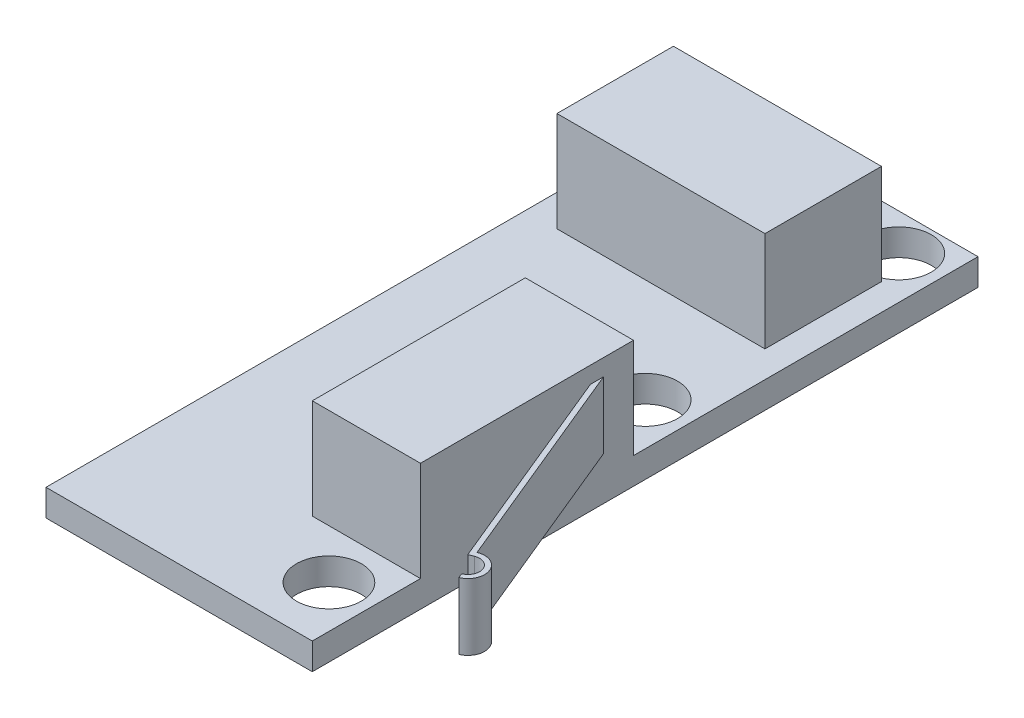
ISO-10303-21;
HEADER;
FILE_DESCRIPTION(('STEP AP214'),'2;1');
FILE_NAME('part.step','',(''),(''),'','','');
FILE_SCHEMA(('AUTOMOTIVE_DESIGN { 1 0 10303 214 1 1 1 1 }'));
ENDSEC;
DATA;
#1=APPLICATION_CONTEXT('core data for automotive mechanical design processes');
#2=APPLICATION_PROTOCOL_DEFINITION('international standard','automotive_design',2000,#1);
#3=PRODUCT_CONTEXT('',#1,'mechanical');
#4=PRODUCT('Part','Part','',(#3));
#5=PRODUCT_RELATED_PRODUCT_CATEGORY('part','',(#4));
#6=PRODUCT_DEFINITION_FORMATION('','',#4);
#7=PRODUCT_DEFINITION_CONTEXT('part definition',#1,'design');
#8=PRODUCT_DEFINITION('design','',#6,#7);
#9=PRODUCT_DEFINITION_SHAPE('','',#8);
#10=(LENGTH_UNIT() NAMED_UNIT(*) SI_UNIT(.MILLI.,.METRE.));
#11=(NAMED_UNIT(*) PLANE_ANGLE_UNIT() SI_UNIT($,.RADIAN.));
#12=(NAMED_UNIT(*) SI_UNIT($,.STERADIAN.) SOLID_ANGLE_UNIT());
#13=UNCERTAINTY_MEASURE_WITH_UNIT(LENGTH_MEASURE(1.E-05),#10,'distance_accuracy_value','');
#14=(GEOMETRIC_REPRESENTATION_CONTEXT(3) GLOBAL_UNCERTAINTY_ASSIGNED_CONTEXT((#13)) GLOBAL_UNIT_ASSIGNED_CONTEXT((#10,
#11,#12)) REPRESENTATION_CONTEXT('',''));
#15=CARTESIAN_POINT('',(0.,0.,0.));
#16=DIRECTION('',(0.,0.,1.));
#17=DIRECTION('',(1.,0.,0.));
#18=AXIS2_PLACEMENT_3D('',#15,#16,#17);
#19=CARTESIAN_POINT('',(0.,1.6,0.));
#20=DIRECTION('',(0.,-1.,0.));
#21=DIRECTION('',(0.,0.,-1.));
#22=AXIS2_PLACEMENT_3D('',#19,#20,#21);
#23=PLANE('',#22);
#24=DIRECTION('',(0.,0.,1.));
#25=VECTOR('',#24,1.);
#26=CARTESIAN_POINT('',(1.9,1.6,-35.8));
#27=LINE('',#26,#25);
#28=CARTESIAN_POINT('',(1.9,1.6,-35.8));
#29=VERTEX_POINT('',#28);
#30=CARTESIAN_POINT('',(1.9,1.6,-28.8));
#31=VERTEX_POINT('',#30);
#32=EDGE_CURVE('E220',#29,#31,#27,.T.);
#33=ORIENTED_EDGE('',*,*,#32,.F.);
#34=DIRECTION('',(-1.,0.,0.));
#35=VECTOR('',#34,1.);
#36=CARTESIAN_POINT('',(1.9,1.6,-35.8));
#37=LINE('',#36,#35);
#38=CARTESIAN_POINT('',(14.4,1.6,-35.8));
#39=VERTEX_POINT('',#38);
#40=EDGE_CURVE('E225',#39,#29,#37,.T.);
#41=ORIENTED_EDGE('',*,*,#40,.F.);
#42=DIRECTION('',(0.,0.,-1.));
#43=VECTOR('',#42,1.);
#44=CARTESIAN_POINT('',(14.4,1.6,-35.8));
#45=LINE('',#44,#43);
#46=CARTESIAN_POINT('',(14.4,1.6,-28.8));
#47=VERTEX_POINT('',#46);
#48=EDGE_CURVE('E237',#47,#39,#45,.T.);
#49=ORIENTED_EDGE('',*,*,#48,.F.);
#50=DIRECTION('',(1.,0.,0.));
#51=VECTOR('',#50,1.);
#52=CARTESIAN_POINT('',(1.9,1.6,-28.8));
#53=LINE('',#52,#51);
#54=EDGE_CURVE('E234',#31,#47,#53,.T.);
#55=ORIENTED_EDGE('',*,*,#54,.F.);
#56=EDGE_LOOP('',(#33,#41,#49,#55));
#57=FACE_BOUND('',#56,.T.);
#58=CARTESIAN_POINT('',(2.55,1.6,-37.792201535651));
#59=DIRECTION('',(0.,1.,0.));
#60=DIRECTION('',(0.,0.,1.));
#61=AXIS2_PLACEMENT_3D('',#58,#59,#60);
#62=CIRCLE('',#61,1.95);
#63=CARTESIAN_POINT('',(2.55,1.6,-35.842201535651));
#64=VERTEX_POINT('',#63);
#65=EDGE_CURVE('E258',#64,#64,#62,.T.);
#66=ORIENTED_EDGE('',*,*,#65,.F.);
#67=EDGE_LOOP('',(#66));
#68=FACE_BOUND('',#67,.T.);
#69=CARTESIAN_POINT('',(13.45,1.6,-22.55));
#70=DIRECTION('',(0.,1.,0.));
#71=DIRECTION('',(0.,0.,1.));
#72=AXIS2_PLACEMENT_3D('',#69,#70,#71);
#73=CIRCLE('',#72,1.95);
#74=CARTESIAN_POINT('',(13.45,1.6,-20.6));
#75=VERTEX_POINT('',#74);
#76=EDGE_CURVE('E253',#75,#75,#73,.T.);
#77=ORIENTED_EDGE('',*,*,#76,.F.);
#78=EDGE_LOOP('',(#77));
#79=FACE_BOUND('',#78,.T.);
#80=CARTESIAN_POINT('',(13.45,1.6,-3.55));
#81=DIRECTION('',(0.,1.,0.));
#82=DIRECTION('',(0.,0.,1.));
#83=AXIS2_PLACEMENT_3D('',#80,#81,#82);
#84=CIRCLE('',#83,1.95);
#85=CARTESIAN_POINT('',(13.45,1.6,-1.6));
#86=VERTEX_POINT('',#85);
#87=EDGE_CURVE('E265',#86,#86,#84,.T.);
#88=ORIENTED_EDGE('',*,*,#87,.F.);
#89=EDGE_LOOP('',(#88));
#90=FACE_BOUND('',#89,.T.);
#91=CARTESIAN_POINT('',(13.45,1.6,-37.792201535651));
#92=DIRECTION('',(0.,1.,0.));
#93=DIRECTION('',(0.,0.,1.));
#94=AXIS2_PLACEMENT_3D('',#91,#92,#93);
#95=CIRCLE('',#94,1.95);
#96=CARTESIAN_POINT('',(13.45,1.6,-35.842201535651));
#97=VERTEX_POINT('',#96);
#98=EDGE_CURVE('E270',#97,#97,#95,.T.);
#99=ORIENTED_EDGE('',*,*,#98,.F.);
#100=EDGE_LOOP('',(#99));
#101=FACE_BOUND('',#100,.T.);
#102=DIRECTION('',(1.,0.,0.));
#103=VECTOR('',#102,1.);
#104=CARTESIAN_POINT('',(9.5,1.6,-6.5));
#105=LINE('',#104,#103);
#106=CARTESIAN_POINT('',(9.5,1.6,-6.5));
#107=VERTEX_POINT('',#106);
#108=CARTESIAN_POINT('',(16.,1.6,-6.5));
#109=VERTEX_POINT('',#108);
#110=EDGE_CURVE('E189',#107,#109,#105,.T.);
#111=ORIENTED_EDGE('',*,*,#110,.F.);
#112=DIRECTION('',(0.,0.,1.));
#113=VECTOR('',#112,1.);
#114=CARTESIAN_POINT('',(9.5,1.6,-19.3));
#115=LINE('',#114,#113);
#116=CARTESIAN_POINT('',(9.5,1.6,-19.3));
#117=VERTEX_POINT('',#116);
#118=EDGE_CURVE('E186',#117,#107,#115,.T.);
#119=ORIENTED_EDGE('',*,*,#118,.F.);
#120=DIRECTION('',(-1.,0.,0.));
#121=VECTOR('',#120,1.);
#122=CARTESIAN_POINT('',(9.5,1.6,-19.3));
#123=LINE('',#122,#121);
#124=CARTESIAN_POINT('',(16.,1.6,-19.3));
#125=VERTEX_POINT('',#124);
#126=EDGE_CURVE('E198',#125,#117,#123,.T.);
#127=ORIENTED_EDGE('',*,*,#126,.F.);
#128=DIRECTION('',(0.,0.,-1.));
#129=VECTOR('',#128,1.);
#130=CARTESIAN_POINT('',(16.,1.6,0.));
#131=LINE('',#130,#129);
#132=CARTESIAN_POINT('',(16.,1.6,-40.));
#133=VERTEX_POINT('',#132);
#134=EDGE_CURVE('E284',#125,#133,#131,.T.);
#135=ORIENTED_EDGE('',*,*,#134,.T.);
#136=DIRECTION('',(-1.,0.,0.));
#137=VECTOR('',#136,1.);
#138=CARTESIAN_POINT('',(0.,1.6,-40.));
#139=LINE('',#138,#137);
#140=CARTESIAN_POINT('',(0.,1.6,-40.));
#141=VERTEX_POINT('',#140);
#142=EDGE_CURVE('E287',#133,#141,#139,.T.);
#143=ORIENTED_EDGE('',*,*,#142,.T.);
#144=DIRECTION('',(0.,0.,1.));
#145=VECTOR('',#144,1.);
#146=CARTESIAN_POINT('',(0.,1.6,0.));
#147=LINE('',#146,#145);
#148=CARTESIAN_POINT('',(0.,1.6,0.));
#149=VERTEX_POINT('',#148);
#150=EDGE_CURVE('E278',#141,#149,#147,.T.);
#151=ORIENTED_EDGE('',*,*,#150,.T.);
#152=DIRECTION('',(1.,0.,0.));
#153=VECTOR('',#152,1.);
#154=CARTESIAN_POINT('',(0.,1.6,0.));
#155=LINE('',#154,#153);
#156=CARTESIAN_POINT('',(16.,1.6,0.));
#157=VERTEX_POINT('',#156);
#158=EDGE_CURVE('E281',#149,#157,#155,.T.);
#159=ORIENTED_EDGE('',*,*,#158,.T.);
#160=EDGE_CURVE('E285',#157,#109,#131,.T.);
#161=ORIENTED_EDGE('',*,*,#160,.T.);
#162=EDGE_LOOP('',(#111,#119,#127,#135,#143,#151,#159,#161));
#163=FACE_BOUND('',#162,.T.);
#164=ADVANCED_FACE('F34',(#57,#68,#79,#90,#101,#163),#23,.F.);
#165=CARTESIAN_POINT('',(0.,1.6,0.));
#166=DIRECTION('',(1.,0.,0.));
#167=DIRECTION('',(0.,0.,-1.));
#168=AXIS2_PLACEMENT_3D('',#165,#166,#167);
#169=PLANE('',#168);
#170=DIRECTION('',(0.,0.,1.));
#171=VECTOR('',#170,1.);
#172=CARTESIAN_POINT('',(0.,0.,0.));
#173=LINE('',#172,#171);
#174=CARTESIAN_POINT('',(0.,0.,-40.));
#175=VERTEX_POINT('',#174);
#176=CARTESIAN_POINT('',(0.,0.,0.));
#177=VERTEX_POINT('',#176);
#178=EDGE_CURVE('E257',#175,#177,#173,.T.);
#179=ORIENTED_EDGE('',*,*,#178,.T.);
#180=DIRECTION('',(0.,-1.,0.));
#181=VECTOR('',#180,1.);
#182=CARTESIAN_POINT('',(0.,1.6,0.));
#183=LINE('',#182,#181);
#184=EDGE_CURVE('E11',#149,#177,#183,.T.);
#185=ORIENTED_EDGE('',*,*,#184,.F.);
#186=ORIENTED_EDGE('',*,*,#150,.F.);
#187=DIRECTION('',(0.,-1.,0.));
#188=VECTOR('',#187,1.);
#189=CARTESIAN_POINT('',(0.,1.6,-40.));
#190=LINE('',#189,#188);
#191=EDGE_CURVE('E289',#141,#175,#190,.T.);
#192=ORIENTED_EDGE('',*,*,#191,.T.);
#193=EDGE_LOOP('',(#179,#185,#186,#192));
#194=FACE_BOUND('',#193,.T.);
#195=ADVANCED_FACE('F36',(#194),#169,.F.);
#196=CARTESIAN_POINT('',(0.,1.6,0.));
#197=DIRECTION('',(0.,0.,-1.));
#198=DIRECTION('',(-1.,0.,0.));
#199=AXIS2_PLACEMENT_3D('',#196,#197,#198);
#200=PLANE('',#199);
#201=DIRECTION('',(1.,0.,0.));
#202=VECTOR('',#201,1.);
#203=CARTESIAN_POINT('',(0.,0.,0.));
#204=LINE('',#203,#202);
#205=CARTESIAN_POINT('',(16.,0.,0.));
#206=VERTEX_POINT('',#205);
#207=EDGE_CURVE('E292',#177,#206,#204,.T.);
#208=ORIENTED_EDGE('',*,*,#207,.T.);
#209=DIRECTION('',(0.,-1.,0.));
#210=VECTOR('',#209,1.);
#211=CARTESIAN_POINT('',(16.,1.6,0.));
#212=LINE('',#211,#210);
#213=EDGE_CURVE('E42',#157,#206,#212,.T.);
#214=ORIENTED_EDGE('',*,*,#213,.F.);
#215=ORIENTED_EDGE('',*,*,#158,.F.);
#216=ORIENTED_EDGE('',*,*,#184,.T.);
#217=EDGE_LOOP('',(#208,#214,#215,#216));
#218=FACE_BOUND('',#217,.T.);
#219=ADVANCED_FACE('F354',(#218),#200,.F.);
#220=CARTESIAN_POINT('',(16.,1.6,0.));
#221=DIRECTION('',(-1.,0.,0.));
#222=DIRECTION('',(0.,0.,1.));
#223=AXIS2_PLACEMENT_3D('',#220,#221,#222);
#224=PLANE('',#223);
#225=DIRECTION('',(0.,1.,0.));
#226=VECTOR('',#225,1.);
#227=CARTESIAN_POINT('',(16.,2.59999999999982,-17.5));
#228=LINE('',#227,#226);
#229=CARTESIAN_POINT('',(16.,2.59999999999982,-17.5));
#230=VERTEX_POINT('',#229);
#231=CARTESIAN_POINT('',(16.,6.59999999999982,-17.5));
#232=VERTEX_POINT('',#231);
#233=EDGE_CURVE('E54',#230,#232,#228,.T.);
#234=ORIENTED_EDGE('',*,*,#233,.F.);
#235=DIRECTION('',(0.,0.,-1.));
#236=VECTOR('',#235,1.);
#237=CARTESIAN_POINT('',(16.,2.59999999999982,-16.7134099560808));
#238=LINE('',#237,#236);
#239=CARTESIAN_POINT('',(16.,2.59999999999982,-16.7134099560808));
#240=VERTEX_POINT('',#239);
#241=EDGE_CURVE('E49',#240,#230,#238,.T.);
#242=ORIENTED_EDGE('',*,*,#241,.F.);
#243=DIRECTION('',(0.,1.,0.));
#244=VECTOR('',#243,1.);
#245=CARTESIAN_POINT('',(16.,2.59999999999982,-16.7134099560808));
#246=LINE('',#245,#244);
#247=CARTESIAN_POINT('',(16.,6.59999999999982,-16.7134099560808));
#248=VERTEX_POINT('',#247);
#249=EDGE_CURVE('E170',#240,#248,#246,.T.);
#250=ORIENTED_EDGE('',*,*,#249,.T.);
#251=DIRECTION('',(0.,0.,-1.));
#252=VECTOR('',#251,1.);
#253=CARTESIAN_POINT('',(16.,6.59999999999982,-16.7134099560808));
#254=LINE('',#253,#252);
#255=EDGE_CURVE('E578',#248,#232,#254,.T.);
#256=ORIENTED_EDGE('',*,*,#255,.T.);
#257=EDGE_LOOP('',(#234,#242,#250,#256));
#258=FACE_BOUND('',#257,.T.);
#259=DIRECTION('',(0.,0.,-1.));
#260=VECTOR('',#259,1.);
#261=CARTESIAN_POINT('',(16.,0.,0.));
#262=LINE('',#261,#260);
#263=CARTESIAN_POINT('',(16.,0.,-40.));
#264=VERTEX_POINT('',#263);
#265=EDGE_CURVE('E294',#206,#264,#262,.T.);
#266=ORIENTED_EDGE('',*,*,#265,.T.);
#267=DIRECTION('',(0.,-1.,0.));
#268=VECTOR('',#267,1.);
#269=CARTESIAN_POINT('',(16.,1.6,-40.));
#270=LINE('',#269,#268);
#271=EDGE_CURVE('E299',#133,#264,#270,.T.);
#272=ORIENTED_EDGE('',*,*,#271,.F.);
#273=ORIENTED_EDGE('',*,*,#134,.F.);
#274=DIRECTION('',(0.,-1.,0.));
#275=VECTOR('',#274,1.);
#276=CARTESIAN_POINT('',(16.,7.6,-19.3));
#277=LINE('',#276,#275);
#278=CARTESIAN_POINT('',(16.,7.6,-19.3));
#279=VERTEX_POINT('',#278);
#280=EDGE_CURVE('E211',#279,#125,#277,.T.);
#281=ORIENTED_EDGE('',*,*,#280,.F.);
#282=DIRECTION('',(0.,0.,-1.));
#283=VECTOR('',#282,1.);
#284=CARTESIAN_POINT('',(16.,7.6,-19.3));
#285=LINE('',#284,#283);
#286=CARTESIAN_POINT('',(16.,7.6,-6.5));
#287=VERTEX_POINT('',#286);
#288=EDGE_CURVE('E200',#287,#279,#285,.T.);
#289=ORIENTED_EDGE('',*,*,#288,.F.);
#290=DIRECTION('',(0.,-1.,0.));
#291=VECTOR('',#290,1.);
#292=CARTESIAN_POINT('',(16.,7.6,-6.5));
#293=LINE('',#292,#291);
#294=EDGE_CURVE('E214',#287,#109,#293,.T.);
#295=ORIENTED_EDGE('',*,*,#294,.T.);
#296=ORIENTED_EDGE('',*,*,#160,.F.);
#297=ORIENTED_EDGE('',*,*,#213,.T.);
#298=EDGE_LOOP('',(#266,#272,#273,#281,#289,#295,#296,#297));
#299=FACE_BOUND('',#298,.T.);
#300=ADVANCED_FACE('F306',(#258,#299),#224,.F.);
#301=CARTESIAN_POINT('',(0.,1.6,-40.));
#302=DIRECTION('',(0.,0.,1.));
#303=DIRECTION('',(1.,0.,0.));
#304=AXIS2_PLACEMENT_3D('',#301,#302,#303);
#305=PLANE('',#304);
#306=DIRECTION('',(-1.,0.,0.));
#307=VECTOR('',#306,1.);
#308=CARTESIAN_POINT('',(0.,0.,-40.));
#309=LINE('',#308,#307);
#310=EDGE_CURVE('E282',#264,#175,#309,.T.);
#311=ORIENTED_EDGE('',*,*,#310,.T.);
#312=ORIENTED_EDGE('',*,*,#191,.F.);
#313=ORIENTED_EDGE('',*,*,#142,.F.);
#314=ORIENTED_EDGE('',*,*,#271,.T.);
#315=EDGE_LOOP('',(#311,#312,#313,#314));
#316=FACE_BOUND('',#315,.T.);
#317=ADVANCED_FACE('F315',(#316),#305,.F.);
#318=CARTESIAN_POINT('',(0.,0.,0.));
#319=DIRECTION('',(0.,-1.,0.));
#320=DIRECTION('',(0.,0.,-1.));
#321=AXIS2_PLACEMENT_3D('',#318,#319,#320);
#322=PLANE('',#321);
#323=CARTESIAN_POINT('',(2.55,0.,-37.792201535651));
#324=DIRECTION('',(0.,1.,0.));
#325=DIRECTION('',(0.,0.,1.));
#326=AXIS2_PLACEMENT_3D('',#323,#324,#325);
#327=CIRCLE('',#326,1.95);
#328=CARTESIAN_POINT('',(2.55,0.,-35.842201535651));
#329=VERTEX_POINT('',#328);
#330=EDGE_CURVE('E254',#329,#329,#327,.T.);
#331=ORIENTED_EDGE('',*,*,#330,.T.);
#332=EDGE_LOOP('',(#331));
#333=FACE_BOUND('',#332,.T.);
#334=CARTESIAN_POINT('',(13.45,0.,-22.55));
#335=DIRECTION('',(0.,1.,0.));
#336=DIRECTION('',(0.,0.,1.));
#337=AXIS2_PLACEMENT_3D('',#334,#335,#336);
#338=CIRCLE('',#337,1.95);
#339=CARTESIAN_POINT('',(13.45,0.,-20.6));
#340=VERTEX_POINT('',#339);
#341=EDGE_CURVE('E262',#340,#340,#338,.T.);
#342=ORIENTED_EDGE('',*,*,#341,.T.);
#343=EDGE_LOOP('',(#342));
#344=FACE_BOUND('',#343,.T.);
#345=CARTESIAN_POINT('',(13.45,0.,-3.55));
#346=DIRECTION('',(0.,1.,0.));
#347=DIRECTION('',(0.,0.,1.));
#348=AXIS2_PLACEMENT_3D('',#345,#346,#347);
#349=CIRCLE('',#348,1.95);
#350=CARTESIAN_POINT('',(13.45,0.,-1.6));
#351=VERTEX_POINT('',#350);
#352=EDGE_CURVE('E273',#351,#351,#349,.T.);
#353=ORIENTED_EDGE('',*,*,#352,.T.);
#354=EDGE_LOOP('',(#353));
#355=FACE_BOUND('',#354,.T.);
#356=CARTESIAN_POINT('',(13.45,0.,-37.792201535651));
#357=DIRECTION('',(0.,1.,0.));
#358=DIRECTION('',(0.,0.,1.));
#359=AXIS2_PLACEMENT_3D('',#356,#357,#358);
#360=CIRCLE('',#359,1.95);
#361=CARTESIAN_POINT('',(13.45,0.,-35.842201535651));
#362=VERTEX_POINT('',#361);
#363=EDGE_CURVE('E261',#362,#362,#360,.T.);
#364=ORIENTED_EDGE('',*,*,#363,.T.);
#365=EDGE_LOOP('',(#364));
#366=FACE_BOUND('',#365,.T.);
#367=ORIENTED_EDGE('',*,*,#178,.F.);
#368=ORIENTED_EDGE('',*,*,#310,.F.);
#369=ORIENTED_EDGE('',*,*,#265,.F.);
#370=ORIENTED_EDGE('',*,*,#207,.F.);
#371=EDGE_LOOP('',(#367,#368,#369,#370));
#372=FACE_BOUND('',#371,.T.);
#373=ADVANCED_FACE('F312',(#333,#344,#355,#366,#372),#322,.T.);
#374=CARTESIAN_POINT('',(13.45,0.,-37.792201535651));
#375=DIRECTION('',(0.,1.,0.));
#376=DIRECTION('',(0.,0.,1.));
#377=AXIS2_PLACEMENT_3D('',#374,#375,#376);
#378=CYLINDRICAL_SURFACE('',#377,1.95);
#379=ORIENTED_EDGE('',*,*,#363,.F.);
#380=EDGE_LOOP('',(#379));
#381=FACE_BOUND('',#380,.T.);
#382=ORIENTED_EDGE('',*,*,#98,.T.);
#383=EDGE_LOOP('',(#382));
#384=FACE_BOUND('',#383,.T.);
#385=ADVANCED_FACE('F362',(#381,#384),#378,.F.);
#386=CARTESIAN_POINT('',(13.45,0.,-3.55));
#387=DIRECTION('',(0.,1.,0.));
#388=DIRECTION('',(0.,0.,1.));
#389=AXIS2_PLACEMENT_3D('',#386,#387,#388);
#390=CYLINDRICAL_SURFACE('',#389,1.95);
#391=ORIENTED_EDGE('',*,*,#352,.F.);
#392=EDGE_LOOP('',(#391));
#393=FACE_BOUND('',#392,.T.);
#394=ORIENTED_EDGE('',*,*,#87,.T.);
#395=EDGE_LOOP('',(#394));
#396=FACE_BOUND('',#395,.T.);
#397=ADVANCED_FACE('F358',(#393,#396),#390,.F.);
#398=CARTESIAN_POINT('',(13.45,0.,-22.55));
#399=DIRECTION('',(0.,1.,0.));
#400=DIRECTION('',(0.,0.,1.));
#401=AXIS2_PLACEMENT_3D('',#398,#399,#400);
#402=CYLINDRICAL_SURFACE('',#401,1.95);
#403=ORIENTED_EDGE('',*,*,#341,.F.);
#404=EDGE_LOOP('',(#403));
#405=FACE_BOUND('',#404,.T.);
#406=ORIENTED_EDGE('',*,*,#76,.T.);
#407=EDGE_LOOP('',(#406));
#408=FACE_BOUND('',#407,.T.);
#409=ADVANCED_FACE('F398',(#405,#408),#402,.F.);
#410=CARTESIAN_POINT('',(2.55,0.,-37.792201535651));
#411=DIRECTION('',(0.,1.,0.));
#412=DIRECTION('',(0.,0.,1.));
#413=AXIS2_PLACEMENT_3D('',#410,#411,#412);
#414=CYLINDRICAL_SURFACE('',#413,1.95);
#415=ORIENTED_EDGE('',*,*,#330,.F.);
#416=EDGE_LOOP('',(#415));
#417=FACE_BOUND('',#416,.T.);
#418=ORIENTED_EDGE('',*,*,#65,.T.);
#419=EDGE_LOOP('',(#418));
#420=FACE_BOUND('',#419,.T.);
#421=ADVANCED_FACE('F405',(#417,#420),#414,.F.);
#422=CARTESIAN_POINT('',(1.9,7.6,-35.8));
#423=DIRECTION('',(1.,0.,0.));
#424=DIRECTION('',(0.,0.,-1.));
#425=AXIS2_PLACEMENT_3D('',#422,#423,#424);
#426=PLANE('',#425);
#427=ORIENTED_EDGE('',*,*,#32,.T.);
#428=DIRECTION('',(0.,-1.,0.));
#429=VECTOR('',#428,1.);
#430=CARTESIAN_POINT('',(1.9,7.6,-28.8));
#431=LINE('',#430,#429);
#432=CARTESIAN_POINT('',(1.9,7.6,-28.8));
#433=VERTEX_POINT('',#432);
#434=EDGE_CURVE('E250',#433,#31,#431,.T.);
#435=ORIENTED_EDGE('',*,*,#434,.F.);
#436=DIRECTION('',(0.,0.,1.));
#437=VECTOR('',#436,1.);
#438=CARTESIAN_POINT('',(1.9,7.6,-35.8));
#439=LINE('',#438,#437);
#440=CARTESIAN_POINT('',(1.9,7.6,-35.8));
#441=VERTEX_POINT('',#440);
#442=EDGE_CURVE('E221',#441,#433,#439,.T.);
#443=ORIENTED_EDGE('',*,*,#442,.F.);
#444=DIRECTION('',(0.,-1.,0.));
#445=VECTOR('',#444,1.);
#446=CARTESIAN_POINT('',(1.9,7.6,-35.8));
#447=LINE('',#446,#445);
#448=EDGE_CURVE('E231',#441,#29,#447,.T.);
#449=ORIENTED_EDGE('',*,*,#448,.T.);
#450=EDGE_LOOP('',(#427,#435,#443,#449));
#451=FACE_BOUND('',#450,.T.);
#452=ADVANCED_FACE('F413',(#451),#426,.F.);
#453=CARTESIAN_POINT('',(1.9,7.6,-28.8));
#454=DIRECTION('',(0.,0.,-1.));
#455=DIRECTION('',(-1.,0.,0.));
#456=AXIS2_PLACEMENT_3D('',#453,#454,#455);
#457=PLANE('',#456);
#458=ORIENTED_EDGE('',*,*,#54,.T.);
#459=DIRECTION('',(0.,-1.,0.));
#460=VECTOR('',#459,1.);
#461=CARTESIAN_POINT('',(14.4,7.6,-28.8));
#462=LINE('',#461,#460);
#463=CARTESIAN_POINT('',(14.4,7.6,-28.8));
#464=VERTEX_POINT('',#463);
#465=EDGE_CURVE('E247',#464,#47,#462,.T.);
#466=ORIENTED_EDGE('',*,*,#465,.F.);
#467=DIRECTION('',(1.,0.,0.));
#468=VECTOR('',#467,1.);
#469=CARTESIAN_POINT('',(1.9,7.6,-28.8));
#470=LINE('',#469,#468);
#471=EDGE_CURVE('E224',#433,#464,#470,.T.);
#472=ORIENTED_EDGE('',*,*,#471,.F.);
#473=ORIENTED_EDGE('',*,*,#434,.T.);
#474=EDGE_LOOP('',(#458,#466,#472,#473));
#475=FACE_BOUND('',#474,.T.);
#476=ADVANCED_FACE('F421',(#475),#457,.F.);
#477=CARTESIAN_POINT('',(14.4,7.6,-35.8));
#478=DIRECTION('',(-1.,0.,0.));
#479=DIRECTION('',(0.,0.,1.));
#480=AXIS2_PLACEMENT_3D('',#477,#478,#479);
#481=PLANE('',#480);
#482=ORIENTED_EDGE('',*,*,#48,.T.);
#483=DIRECTION('',(0.,-1.,0.));
#484=VECTOR('',#483,1.);
#485=CARTESIAN_POINT('',(14.4,7.6,-35.8));
#486=LINE('',#485,#484);
#487=CARTESIAN_POINT('',(14.4,7.6,-35.8));
#488=VERTEX_POINT('',#487);
#489=EDGE_CURVE('E244',#488,#39,#486,.T.);
#490=ORIENTED_EDGE('',*,*,#489,.F.);
#491=DIRECTION('',(0.,0.,-1.));
#492=VECTOR('',#491,1.);
#493=CARTESIAN_POINT('',(14.4,7.6,-35.8));
#494=LINE('',#493,#492);
#495=EDGE_CURVE('E227',#464,#488,#494,.T.);
#496=ORIENTED_EDGE('',*,*,#495,.F.);
#497=ORIENTED_EDGE('',*,*,#465,.T.);
#498=EDGE_LOOP('',(#482,#490,#496,#497));
#499=FACE_BOUND('',#498,.T.);
#500=ADVANCED_FACE('F429',(#499),#481,.F.);
#501=CARTESIAN_POINT('',(1.9,7.6,-35.8));
#502=DIRECTION('',(0.,0.,1.));
#503=DIRECTION('',(1.,0.,0.));
#504=AXIS2_PLACEMENT_3D('',#501,#502,#503);
#505=PLANE('',#504);
#506=ORIENTED_EDGE('',*,*,#40,.T.);
#507=ORIENTED_EDGE('',*,*,#448,.F.);
#508=DIRECTION('',(-1.,0.,0.));
#509=VECTOR('',#508,1.);
#510=CARTESIAN_POINT('',(1.9,7.6,-35.8));
#511=LINE('',#510,#509);
#512=EDGE_CURVE('E229',#488,#441,#511,.T.);
#513=ORIENTED_EDGE('',*,*,#512,.F.);
#514=ORIENTED_EDGE('',*,*,#489,.T.);
#515=EDGE_LOOP('',(#506,#507,#513,#514));
#516=FACE_BOUND('',#515,.T.);
#517=ADVANCED_FACE('F345',(#516),#505,.F.);
#518=CARTESIAN_POINT('',(0.,7.6,0.));
#519=DIRECTION('',(0.,1.,0.));
#520=DIRECTION('',(0.,0.,1.));
#521=AXIS2_PLACEMENT_3D('',#518,#519,#520);
#522=PLANE('',#521);
#523=ORIENTED_EDGE('',*,*,#442,.T.);
#524=ORIENTED_EDGE('',*,*,#471,.T.);
#525=ORIENTED_EDGE('',*,*,#495,.T.);
#526=ORIENTED_EDGE('',*,*,#512,.T.);
#527=EDGE_LOOP('',(#523,#524,#525,#526));
#528=FACE_BOUND('',#527,.T.);
#529=ADVANCED_FACE('F338',(#528),#522,.T.);
#530=CARTESIAN_POINT('',(9.5,7.6,-19.3));
#531=DIRECTION('',(1.,0.,0.));
#532=DIRECTION('',(0.,0.,-1.));
#533=AXIS2_PLACEMENT_3D('',#530,#531,#532);
#534=PLANE('',#533);
#535=ORIENTED_EDGE('',*,*,#118,.T.);
#536=DIRECTION('',(0.,-1.,0.));
#537=VECTOR('',#536,1.);
#538=CARTESIAN_POINT('',(9.5,7.6,-6.5));
#539=LINE('',#538,#537);
#540=CARTESIAN_POINT('',(9.5,7.6,-6.5));
#541=VERTEX_POINT('',#540);
#542=EDGE_CURVE('E217',#541,#107,#539,.T.);
#543=ORIENTED_EDGE('',*,*,#542,.F.);
#544=DIRECTION('',(0.,0.,1.));
#545=VECTOR('',#544,1.);
#546=CARTESIAN_POINT('',(9.5,7.6,-19.3));
#547=LINE('',#546,#545);
#548=CARTESIAN_POINT('',(9.5,7.6,-19.3));
#549=VERTEX_POINT('',#548);
#550=EDGE_CURVE('E194',#549,#541,#547,.T.);
#551=ORIENTED_EDGE('',*,*,#550,.F.);
#552=DIRECTION('',(0.,-1.,0.));
#553=VECTOR('',#552,1.);
#554=CARTESIAN_POINT('',(9.5,7.6,-19.3));
#555=LINE('',#554,#553);
#556=EDGE_CURVE('E203',#549,#117,#555,.T.);
#557=ORIENTED_EDGE('',*,*,#556,.T.);
#558=EDGE_LOOP('',(#535,#543,#551,#557));
#559=FACE_BOUND('',#558,.T.);
#560=ADVANCED_FACE('F336',(#559),#534,.F.);
#561=CARTESIAN_POINT('',(9.5,7.6,-6.5));
#562=DIRECTION('',(0.,0.,-1.));
#563=DIRECTION('',(-1.,0.,0.));
#564=AXIS2_PLACEMENT_3D('',#561,#562,#563);
#565=PLANE('',#564);
#566=ORIENTED_EDGE('',*,*,#110,.T.);
#567=ORIENTED_EDGE('',*,*,#294,.F.);
#568=DIRECTION('',(1.,0.,0.));
#569=VECTOR('',#568,1.);
#570=CARTESIAN_POINT('',(9.5,7.6,-6.5));
#571=LINE('',#570,#569);
#572=EDGE_CURVE('E197',#541,#287,#571,.T.);
#573=ORIENTED_EDGE('',*,*,#572,.F.);
#574=ORIENTED_EDGE('',*,*,#542,.T.);
#575=EDGE_LOOP('',(#566,#567,#573,#574));
#576=FACE_BOUND('',#575,.T.);
#577=ADVANCED_FACE('F334',(#576),#565,.F.);
#578=CARTESIAN_POINT('',(9.5,7.6,-19.3));
#579=DIRECTION('',(0.,0.,1.));
#580=DIRECTION('',(1.,0.,0.));
#581=AXIS2_PLACEMENT_3D('',#578,#579,#580);
#582=PLANE('',#581);
#583=ORIENTED_EDGE('',*,*,#126,.T.);
#584=ORIENTED_EDGE('',*,*,#556,.F.);
#585=DIRECTION('',(-1.,0.,0.));
#586=VECTOR('',#585,1.);
#587=CARTESIAN_POINT('',(9.5,7.6,-19.3));
#588=LINE('',#587,#586);
#589=EDGE_CURVE('E202',#279,#549,#588,.T.);
#590=ORIENTED_EDGE('',*,*,#589,.F.);
#591=ORIENTED_EDGE('',*,*,#280,.T.);
#592=EDGE_LOOP('',(#583,#584,#590,#591));
#593=FACE_BOUND('',#592,.T.);
#594=ADVANCED_FACE('F327',(#593),#582,.F.);
#595=CARTESIAN_POINT('',(0.,7.6,0.));
#596=DIRECTION('',(0.,1.,0.));
#597=DIRECTION('',(0.,0.,1.));
#598=AXIS2_PLACEMENT_3D('',#595,#596,#597);
#599=PLANE('',#598);
#600=ORIENTED_EDGE('',*,*,#550,.T.);
#601=ORIENTED_EDGE('',*,*,#572,.T.);
#602=ORIENTED_EDGE('',*,*,#288,.T.);
#603=ORIENTED_EDGE('',*,*,#589,.T.);
#604=EDGE_LOOP('',(#600,#601,#602,#603));
#605=FACE_BOUND('',#604,.T.);
#606=ADVANCED_FACE('F330',(#605),#599,.T.);
#607=CARTESIAN_POINT('',(21.4539210522231,2.59999999999982,-4.28089469154143));
#608=DIRECTION('',(-0.38174394539077,0.,-0.924268121357374));
#609=DIRECTION('',(-0.924268121357374,0.,0.38174394539077));
#610=AXIS2_PLACEMENT_3D('',#607,#608,#609);
#611=PLANE('',#610);
#612=DIRECTION('',(-0.924268121357374,0.,0.38174394539077));
#613=VECTOR('',#612,1.);
#614=CARTESIAN_POINT('',(21.4539210522231,6.59999999999982,-4.28089469154143));
#615=LINE('',#614,#613);
#616=CARTESIAN_POINT('',(21.4539210522231,6.59999999999982,-4.28089469154143));
#617=VERTEX_POINT('',#616);
#618=CARTESIAN_POINT('',(21.1766405958401,6.59999999999982,-4.16637149967372));
#619=VERTEX_POINT('',#618);
#620=EDGE_CURVE('E185',#617,#619,#615,.T.);
#621=ORIENTED_EDGE('',*,*,#620,.T.);
#622=DIRECTION('',(0.,1.,0.));
#623=VECTOR('',#622,1.);
#624=CARTESIAN_POINT('',(21.1766405958401,2.59999999999982,-4.16637149967372));
#625=LINE('',#624,#623);
#626=CARTESIAN_POINT('',(21.1766405958401,2.59999999999982,-4.16637149967372));
#627=VERTEX_POINT('',#626);
#628=EDGE_CURVE('E168',#627,#619,#625,.T.);
#629=ORIENTED_EDGE('',*,*,#628,.F.);
#630=DIRECTION('',(-0.924268121357374,0.,0.38174394539077));
#631=VECTOR('',#630,1.);
#632=CARTESIAN_POINT('',(21.4539210522231,2.59999999999982,-4.28089469154143));
#633=LINE('',#632,#631);
#634=CARTESIAN_POINT('',(21.4539210522231,2.59999999999982,-4.28089469154143));
#635=VERTEX_POINT('',#634);
#636=EDGE_CURVE('E172',#635,#627,#633,.T.);
#637=ORIENTED_EDGE('',*,*,#636,.F.);
#638=DIRECTION('',(0.,1.,0.));
#639=VECTOR('',#638,1.);
#640=CARTESIAN_POINT('',(21.4539210522231,2.59999999999982,-4.28089469154143));
#641=LINE('',#640,#639);
#642=EDGE_CURVE('E557',#635,#617,#641,.T.);
#643=ORIENTED_EDGE('',*,*,#642,.T.);
#644=EDGE_LOOP('',(#621,#629,#637,#643));
#645=FACE_BOUND('',#644,.T.);
#646=ADVANCED_FACE('F183',(#645),#611,.F.);
#647=CARTESIAN_POINT('',(21.1766405958401,2.59999999999982,-4.16637149967372));
#648=DIRECTION('',(0.924412958633467,0.,-0.381393080575042));
#649=DIRECTION('',(-0.381393080575042,0.,-0.924412958633467));
#650=AXIS2_PLACEMENT_3D('',#647,#648,#649);
#651=PLANE('',#650);
#652=DIRECTION('',(-0.381393080575042,0.,-0.924412958633467));
#653=VECTOR('',#652,1.);
#654=CARTESIAN_POINT('',(21.1766405958401,6.59999999999982,-4.16637149967372));
#655=LINE('',#654,#653);
#656=EDGE_CURVE('E555',#619,#248,#655,.T.);
#657=ORIENTED_EDGE('',*,*,#656,.T.);
#658=ORIENTED_EDGE('',*,*,#249,.F.);
#659=DIRECTION('',(-0.381393080575042,0.,-0.924412958633467));
#660=VECTOR('',#659,1.);
#661=CARTESIAN_POINT('',(21.1766405958401,2.59999999999982,-4.16637149967372));
#662=LINE('',#661,#660);
#663=EDGE_CURVE('E163',#627,#240,#662,.T.);
#664=ORIENTED_EDGE('',*,*,#663,.F.);
#665=ORIENTED_EDGE('',*,*,#628,.T.);
#666=EDGE_LOOP('',(#657,#658,#664,#665));
#667=FACE_BOUND('',#666,.T.);
#668=ADVANCED_FACE('F166',(#667),#651,.F.);
#669=CARTESIAN_POINT('',(16.,2.59999999999982,-17.5));
#670=DIRECTION('',(-0.924412958633467,0.,0.381393080575043));
#671=DIRECTION('',(0.381393080575043,0.,0.924412958633467));
#672=AXIS2_PLACEMENT_3D('',#669,#670,#671);
#673=PLANE('',#672);
#674=DIRECTION('',(0.381393080575043,0.,0.924412958633467));
#675=VECTOR('',#674,1.);
#676=CARTESIAN_POINT('',(16.,6.59999999999982,-17.5));
#677=LINE('',#676,#675);
#678=CARTESIAN_POINT('',(21.3395031280506,6.59999999999982,-4.55821857913147));
#679=VERTEX_POINT('',#678);
#680=EDGE_CURVE('E575',#232,#679,#677,.T.);
#681=ORIENTED_EDGE('',*,*,#680,.T.);
#682=DIRECTION('',(0.,1.,0.));
#683=VECTOR('',#682,1.);
#684=CARTESIAN_POINT('',(21.3395031280506,2.59999999999982,-4.55821857913147));
#685=LINE('',#684,#683);
#686=CARTESIAN_POINT('',(21.3395031280506,2.59999999999982,-4.55821857913147));
#687=VERTEX_POINT('',#686);
#688=EDGE_CURVE('E570',#687,#679,#685,.T.);
#689=ORIENTED_EDGE('',*,*,#688,.F.);
#690=DIRECTION('',(0.381393080575043,0.,0.924412958633467));
#691=VECTOR('',#690,1.);
#692=CARTESIAN_POINT('',(16.,2.59999999999982,-17.5));
#693=LINE('',#692,#691);
#694=EDGE_CURVE('E576',#230,#687,#693,.T.);
#695=ORIENTED_EDGE('',*,*,#694,.F.);
#696=ORIENTED_EDGE('',*,*,#233,.T.);
#697=EDGE_LOOP('',(#681,#689,#695,#696));
#698=FACE_BOUND('',#697,.T.);
#699=ADVANCED_FACE('F487',(#698),#673,.F.);
#700=CARTESIAN_POINT('',(21.7208962086256,2.59999999999982,-3.633805620498));
#701=DIRECTION('',(0.,1.,0.));
#702=DIRECTION('',(0.,0.,1.));
#703=AXIS2_PLACEMENT_3D('',#700,#701,#702);
#704=CYLINDRICAL_SURFACE('',#703,1.);
#705=CARTESIAN_POINT('',(21.7208962086256,6.59999999999982,-3.633805620498));
#706=DIRECTION('',(0.,-1.,0.));
#707=DIRECTION('',(0.,0.,-1.));
#708=AXIS2_PLACEMENT_3D('',#705,#706,#707);
#709=CIRCLE('',#708,1.);
#710=CARTESIAN_POINT('',(22.1022892892007,6.59999999999982,-2.70939266186453));
#711=VERTEX_POINT('',#710);
#712=EDGE_CURVE('E562',#679,#711,#709,.T.);
#713=ORIENTED_EDGE('',*,*,#712,.T.);
#714=DIRECTION('',(0.,1.,0.));
#715=VECTOR('',#714,1.);
#716=CARTESIAN_POINT('',(22.1022892892007,2.59999999999982,-2.70939266186453));
#717=LINE('',#716,#715);
#718=CARTESIAN_POINT('',(22.1022892892007,2.59999999999982,-2.70939266186453));
#719=VERTEX_POINT('',#718);
#720=EDGE_CURVE('E568',#719,#711,#717,.T.);
#721=ORIENTED_EDGE('',*,*,#720,.F.);
#722=CARTESIAN_POINT('',(21.7208962086256,2.59999999999982,-3.633805620498));
#723=DIRECTION('',(0.,-1.,0.));
#724=DIRECTION('',(0.,0.,-1.));
#725=AXIS2_PLACEMENT_3D('',#722,#723,#724);
#726=CIRCLE('',#725,1.);
#727=EDGE_CURVE('E588',#687,#719,#726,.T.);
#728=ORIENTED_EDGE('',*,*,#727,.F.);
#729=ORIENTED_EDGE('',*,*,#688,.T.);
#730=EDGE_LOOP('',(#713,#721,#728,#729));
#731=FACE_BOUND('',#730,.T.);
#732=ADVANCED_FACE('F494',(#731),#704,.T.);
#733=CARTESIAN_POINT('',(21.9878713650282,2.59999999999982,-2.98671654945457));
#734=DIRECTION('',(-0.924412958633473,0.,0.381393080575028));
#735=DIRECTION('',(0.381393080575028,0.,0.924412958633473));
#736=AXIS2_PLACEMENT_3D('',#733,#734,#735);
#737=PLANE('',#736);
#738=DIRECTION('',(0.381393080575028,0.,0.924412958633473));
#739=VECTOR('',#738,1.);
#740=CARTESIAN_POINT('',(21.9878713650282,6.59999999999982,-2.98671654945457));
#741=LINE('',#740,#739);
#742=CARTESIAN_POINT('',(21.9878713650282,6.59999999999982,-2.98671654945457));
#743=VERTEX_POINT('',#742);
#744=EDGE_CURVE('E560',#743,#711,#741,.T.);
#745=ORIENTED_EDGE('',*,*,#744,.F.);
#746=DIRECTION('',(0.,1.,0.));
#747=VECTOR('',#746,1.);
#748=CARTESIAN_POINT('',(21.9878713650282,2.59999999999982,-2.98671654945457));
#749=LINE('',#748,#747);
#750=CARTESIAN_POINT('',(21.9878713650282,2.59999999999982,-2.98671654945457));
#751=VERTEX_POINT('',#750);
#752=EDGE_CURVE('E558',#751,#743,#749,.T.);
#753=ORIENTED_EDGE('',*,*,#752,.F.);
#754=DIRECTION('',(0.381393080575028,0.,0.924412958633473));
#755=VECTOR('',#754,1.);
#756=CARTESIAN_POINT('',(21.9878713650282,2.59999999999982,-2.98671654945457));
#757=LINE('',#756,#755);
#758=EDGE_CURVE('E585',#751,#719,#757,.T.);
#759=ORIENTED_EDGE('',*,*,#758,.T.);
#760=ORIENTED_EDGE('',*,*,#720,.T.);
#761=EDGE_LOOP('',(#745,#753,#759,#760));
#762=FACE_BOUND('',#761,.T.);
#763=ADVANCED_FACE('F502',(#762),#737,.T.);
#764=CARTESIAN_POINT('',(21.7208962086256,2.59999999999982,-3.633805620498));
#765=DIRECTION('',(0.,1.,0.));
#766=DIRECTION('',(0.,0.,1.));
#767=AXIS2_PLACEMENT_3D('',#764,#765,#766);
#768=CYLINDRICAL_SURFACE('',#767,0.700000000000002);
#769=CARTESIAN_POINT('',(21.7208962086256,6.59999999999982,-3.633805620498));
#770=DIRECTION('',(0.,-1.,0.));
#771=DIRECTION('',(0.,0.,-1.));
#772=AXIS2_PLACEMENT_3D('',#769,#770,#771);
#773=CIRCLE('',#772,0.700000000000002);
#774=EDGE_CURVE('E181',#617,#743,#773,.T.);
#775=ORIENTED_EDGE('',*,*,#774,.F.);
#776=ORIENTED_EDGE('',*,*,#642,.F.);
#777=CARTESIAN_POINT('',(21.7208962086256,2.59999999999982,-3.633805620498));
#778=DIRECTION('',(0.,-1.,0.));
#779=DIRECTION('',(0.,0.,-1.));
#780=AXIS2_PLACEMENT_3D('',#777,#778,#779);
#781=CIRCLE('',#780,0.700000000000002);
#782=EDGE_CURVE('E179',#635,#751,#781,.T.);
#783=ORIENTED_EDGE('',*,*,#782,.T.);
#784=ORIENTED_EDGE('',*,*,#752,.T.);
#785=EDGE_LOOP('',(#775,#776,#783,#784));
#786=FACE_BOUND('',#785,.T.);
#787=ADVANCED_FACE('F510',(#786),#768,.F.);
#788=CARTESIAN_POINT('',(21.7208962086256,2.59999999999982,-3.633805620498));
#789=DIRECTION('',(0.,-1.,0.));
#790=DIRECTION('',(0.,0.,-1.));
#791=AXIS2_PLACEMENT_3D('',#788,#789,#790);
#792=PLANE('',#791);
#793=ORIENTED_EDGE('',*,*,#636,.T.);
#794=ORIENTED_EDGE('',*,*,#663,.T.);
#795=ORIENTED_EDGE('',*,*,#241,.T.);
#796=ORIENTED_EDGE('',*,*,#694,.T.);
#797=ORIENTED_EDGE('',*,*,#727,.T.);
#798=ORIENTED_EDGE('',*,*,#758,.F.);
#799=ORIENTED_EDGE('',*,*,#782,.F.);
#800=EDGE_LOOP('',(#793,#794,#795,#796,#797,#798,#799));
#801=FACE_BOUND('',#800,.T.);
#802=ADVANCED_FACE('F176',(#801),#792,.T.);
#803=CARTESIAN_POINT('',(21.7208962086256,6.59999999999982,-3.633805620498));
#804=DIRECTION('',(0.,-1.,0.));
#805=DIRECTION('',(0.,0.,-1.));
#806=AXIS2_PLACEMENT_3D('',#803,#804,#805);
#807=PLANE('',#806);
#808=ORIENTED_EDGE('',*,*,#620,.F.);
#809=ORIENTED_EDGE('',*,*,#774,.T.);
#810=ORIENTED_EDGE('',*,*,#744,.T.);
#811=ORIENTED_EDGE('',*,*,#712,.F.);
#812=ORIENTED_EDGE('',*,*,#680,.F.);
#813=ORIENTED_EDGE('',*,*,#255,.F.);
#814=ORIENTED_EDGE('',*,*,#656,.F.);
#815=EDGE_LOOP('',(#808,#809,#810,#811,#812,#813,#814));
#816=FACE_BOUND('',#815,.T.);
#817=ADVANCED_FACE('F525',(#816),#807,.F.);
#818=CLOSED_SHELL('',(#164,#195,#219,#300,#317,#373,#385,#397,#409,#421,#452,#476,#500,#517,
#529,#560,#577,#594,#606,#646,#668,#699,#732,#763,#787,#802,#817));
#819=MANIFOLD_SOLID_BREP('B2',#818);
#820=ADVANCED_BREP_SHAPE_REPRESENTATION('',(#18,#819),#14);
#821=SHAPE_DEFINITION_REPRESENTATION(#9,#820);
ENDSEC;
END-ISO-10303-21;
